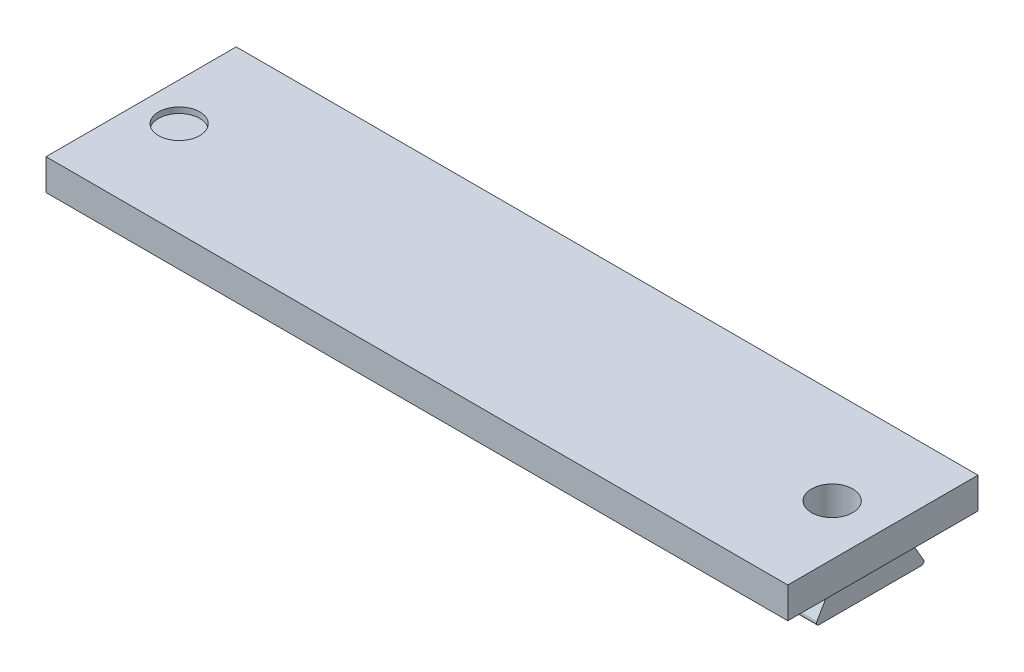
ISO-10303-21;
HEADER;
FILE_DESCRIPTION(('STEP AP214'),'2;1');
FILE_NAME('part.step','',(''),(''),'','','');
FILE_SCHEMA(('AUTOMOTIVE_DESIGN { 1 0 10303 214 1 1 1 1 }'));
ENDSEC;
DATA;
#1=APPLICATION_CONTEXT('core data for automotive mechanical design processes');
#2=APPLICATION_PROTOCOL_DEFINITION('international standard','automotive_design',2000,#1);
#3=PRODUCT_CONTEXT('',#1,'mechanical');
#4=PRODUCT('Part','Part','',(#3));
#5=PRODUCT_RELATED_PRODUCT_CATEGORY('part','',(#4));
#6=PRODUCT_DEFINITION_FORMATION('','',#4);
#7=PRODUCT_DEFINITION_CONTEXT('part definition',#1,'design');
#8=PRODUCT_DEFINITION('design','',#6,#7);
#9=PRODUCT_DEFINITION_SHAPE('','',#8);
#10=(LENGTH_UNIT() NAMED_UNIT(*) SI_UNIT(.MILLI.,.METRE.));
#11=(NAMED_UNIT(*) PLANE_ANGLE_UNIT() SI_UNIT($,.RADIAN.));
#12=(NAMED_UNIT(*) SI_UNIT($,.STERADIAN.) SOLID_ANGLE_UNIT());
#13=UNCERTAINTY_MEASURE_WITH_UNIT(LENGTH_MEASURE(1.E-05),#10,'distance_accuracy_value','');
#14=(GEOMETRIC_REPRESENTATION_CONTEXT(3) GLOBAL_UNCERTAINTY_ASSIGNED_CONTEXT((#13)) GLOBAL_UNIT_ASSIGNED_CONTEXT((#10,
#11,#12)) REPRESENTATION_CONTEXT('',''));
#15=CARTESIAN_POINT('',(0.,0.,0.));
#16=DIRECTION('',(0.,0.,1.));
#17=DIRECTION('',(1.,0.,0.));
#18=AXIS2_PLACEMENT_3D('',#15,#16,#17);
#19=CARTESIAN_POINT('',(57.5,0.,0.));
#20=DIRECTION('',(-1.,0.,0.));
#21=DIRECTION('',(0.,0.,1.));
#22=AXIS2_PLACEMENT_3D('',#19,#20,#21);
#23=PLANE('',#22);
#24=DIRECTION('',(0.,0.,-1.));
#25=VECTOR('',#24,1.);
#26=CARTESIAN_POINT('',(57.5,0.100000000000003,15.));
#27=LINE('',#26,#25);
#28=CARTESIAN_POINT('',(57.5,0.1,6.7494446500535));
#29=VERTEX_POINT('',#28);
#30=CARTESIAN_POINT('',(57.5,0.100000000000001,-6.7494446500535));
#31=VERTEX_POINT('',#30);
#32=EDGE_CURVE('E50',#29,#31,#27,.T.);
#33=ORIENTED_EDGE('',*,*,#32,.F.);
#34=CARTESIAN_POINT('',(57.5,-0.4,6.7494446500535));
#35=DIRECTION('',(-1.,0.,0.));
#36=DIRECTION('',(0.,0.,1.));
#37=AXIS2_PLACEMENT_3D('',#34,#35,#36);
#38=CIRCLE('',#37,0.5);
#39=CARTESIAN_POINT('',(57.5,-0.649999999999998,6.31643194816128));
#40=VERTEX_POINT('',#39);
#41=EDGE_CURVE('E157',#29,#40,#38,.T.);
#42=ORIENTED_EDGE('',*,*,#41,.T.);
#43=DIRECTION('',(0.,-0.866025403784441,0.499999999999995));
#44=VECTOR('',#43,1.);
#45=CARTESIAN_POINT('',(57.5,-4.9,8.77017059221715));
#46=LINE('',#45,#44);
#47=CARTESIAN_POINT('',(57.5,-4.3,8.42376043070339));
#48=VERTEX_POINT('',#47);
#49=EDGE_CURVE('E175',#40,#48,#46,.T.);
#50=ORIENTED_EDGE('',*,*,#49,.T.);
#51=CARTESIAN_POINT('',(57.5,-4.5,8.07735026918961));
#52=DIRECTION('',(-1.,0.,0.));
#53=DIRECTION('',(0.,0.,1.));
#54=AXIS2_PLACEMENT_3D('',#51,#52,#53);
#55=CIRCLE('',#54,0.4);
#56=CARTESIAN_POINT('',(57.5,-4.9,8.07735026918961));
#57=VERTEX_POINT('',#56);
#58=EDGE_CURVE('E218',#48,#57,#55,.F.);
#59=ORIENTED_EDGE('',*,*,#58,.T.);
#60=DIRECTION('',(0.,0.,-1.));
#61=VECTOR('',#60,1.);
#62=CARTESIAN_POINT('',(57.5,-4.9,-8.77017059221716));
#63=LINE('',#62,#61);
#64=CARTESIAN_POINT('',(57.5,-4.9,-8.07735026918961));
#65=VERTEX_POINT('',#64);
#66=EDGE_CURVE('E177',#57,#65,#63,.T.);
#67=ORIENTED_EDGE('',*,*,#66,.T.);
#68=CARTESIAN_POINT('',(57.5,-4.5,-8.07735026918961));
#69=DIRECTION('',(-1.,0.,0.));
#70=DIRECTION('',(0.,0.,1.));
#71=AXIS2_PLACEMENT_3D('',#68,#69,#70);
#72=CIRCLE('',#71,0.4);
#73=CARTESIAN_POINT('',(57.5,-4.3,-8.42376043070339));
#74=VERTEX_POINT('',#73);
#75=EDGE_CURVE('E220',#65,#74,#72,.F.);
#76=ORIENTED_EDGE('',*,*,#75,.T.);
#77=DIRECTION('',(0.,0.866025403784441,0.499999999999995));
#78=VECTOR('',#77,1.);
#79=CARTESIAN_POINT('',(57.5,-4.9,-8.77017059221716));
#80=LINE('',#79,#78);
#81=CARTESIAN_POINT('',(57.5,-0.649999999999997,-6.31643194816128));
#82=VERTEX_POINT('',#81);
#83=EDGE_CURVE('E181',#74,#82,#80,.T.);
#84=ORIENTED_EDGE('',*,*,#83,.T.);
#85=CARTESIAN_POINT('',(57.5,-0.399999999999999,-6.7494446500535));
#86=DIRECTION('',(-1.,0.,0.));
#87=DIRECTION('',(0.,0.,1.));
#88=AXIS2_PLACEMENT_3D('',#85,#86,#87);
#89=CIRCLE('',#88,0.5);
#90=EDGE_CURVE('E237',#82,#31,#89,.T.);
#91=ORIENTED_EDGE('',*,*,#90,.T.);
#92=EDGE_LOOP('',(#33,#42,#50,#59,#67,#76,#84,#91));
#93=FACE_BOUND('',#92,.T.);
#94=ADVANCED_FACE('F35',(#93),#23,.F.);
#95=CARTESIAN_POINT('',(57.5,5.,15.));
#96=DIRECTION('',(0.,0.,-1.));
#97=DIRECTION('',(-1.,0.,0.));
#98=AXIS2_PLACEMENT_3D('',#95,#96,#97);
#99=PLANE('',#98);
#100=DIRECTION('',(0.,-1.,0.));
#101=VECTOR('',#100,1.);
#102=CARTESIAN_POINT('',(-57.5,5.,15.));
#103=LINE('',#102,#101);
#104=CARTESIAN_POINT('',(-57.5,5.,15.));
#105=VERTEX_POINT('',#104);
#106=CARTESIAN_POINT('',(-57.5,0.1,15.));
#107=VERTEX_POINT('',#106);
#108=EDGE_CURVE('E132',#105,#107,#103,.T.);
#109=ORIENTED_EDGE('',*,*,#108,.T.);
#110=DIRECTION('',(-1.,0.,0.));
#111=VECTOR('',#110,1.);
#112=CARTESIAN_POINT('',(57.5,0.1,15.));
#113=LINE('',#112,#111);
#114=CARTESIAN_POINT('',(59.5,0.100000000000003,15.));
#115=VERTEX_POINT('',#114);
#116=EDGE_CURVE('E125',#115,#107,#113,.T.);
#117=ORIENTED_EDGE('',*,*,#116,.F.);
#118=DIRECTION('',(0.,-1.,0.));
#119=VECTOR('',#118,1.);
#120=CARTESIAN_POINT('',(59.5,5.,15.));
#121=LINE('',#120,#119);
#122=CARTESIAN_POINT('',(59.5,5.,15.));
#123=VERTEX_POINT('',#122);
#124=EDGE_CURVE('E130',#123,#115,#121,.T.);
#125=ORIENTED_EDGE('',*,*,#124,.F.);
#126=DIRECTION('',(-1.,0.,0.));
#127=VECTOR('',#126,1.);
#128=CARTESIAN_POINT('',(57.5,5.,15.));
#129=LINE('',#128,#127);
#130=EDGE_CURVE('E184',#123,#105,#129,.T.);
#131=ORIENTED_EDGE('',*,*,#130,.T.);
#132=EDGE_LOOP('',(#109,#117,#125,#131));
#133=FACE_BOUND('',#132,.T.);
#134=ADVANCED_FACE('F127',(#133),#99,.F.);
#135=CARTESIAN_POINT('',(57.5,-4.9,8.77017059221715));
#136=DIRECTION('',(0.,-0.499999999999995,-0.866025403784441));
#137=DIRECTION('',(0.,0.866025403784441,-0.499999999999995));
#138=AXIS2_PLACEMENT_3D('',#135,#136,#137);
#139=PLANE('',#138);
#140=ORIENTED_EDGE('',*,*,#49,.F.);
#141=DIRECTION('',(-1.,0.,0.));
#142=VECTOR('',#141,1.);
#143=CARTESIAN_POINT('',(-57.5,-0.649999999999998,6.31643194816128));
#144=LINE('',#143,#142);
#145=CARTESIAN_POINT('',(-57.5,-0.649999999999998,6.31643194816128));
#146=VERTEX_POINT('',#145);
#147=EDGE_CURVE('E230',#40,#146,#144,.T.);
#148=ORIENTED_EDGE('',*,*,#147,.T.);
#149=DIRECTION('',(0.,-0.866025403784441,0.499999999999995));
#150=VECTOR('',#149,1.);
#151=CARTESIAN_POINT('',(-57.5,-4.9,8.77017059221715));
#152=LINE('',#151,#150);
#153=CARTESIAN_POINT('',(-57.5,-4.3,8.42376043070339));
#154=VERTEX_POINT('',#153);
#155=EDGE_CURVE('E188',#146,#154,#152,.T.);
#156=ORIENTED_EDGE('',*,*,#155,.T.);
#157=DIRECTION('',(-1.,0.,0.));
#158=VECTOR('',#157,1.);
#159=CARTESIAN_POINT('',(57.5,-4.3,8.42376043070339));
#160=LINE('',#159,#158);
#161=EDGE_CURVE('E222',#154,#48,#160,.F.);
#162=ORIENTED_EDGE('',*,*,#161,.T.);
#163=EDGE_LOOP('',(#140,#148,#156,#162));
#164=FACE_BOUND('',#163,.T.);
#165=ADVANCED_FACE('F278',(#164),#139,.F.);
#166=CARTESIAN_POINT('',(57.5,-4.9,-8.77017059221716));
#167=DIRECTION('',(0.,1.,0.));
#168=DIRECTION('',(0.,0.,1.));
#169=AXIS2_PLACEMENT_3D('',#166,#167,#168);
#170=PLANE('',#169);
#171=CARTESIAN_POINT('',(51.5,-4.9,0.));
#172=DIRECTION('',(0.,1.,0.));
#173=DIRECTION('',(0.,0.,1.));
#174=AXIS2_PLACEMENT_3D('',#171,#172,#173);
#175=CIRCLE('',#174,4.75000000000002);
#176=CARTESIAN_POINT('',(51.5,-4.9,4.75000000000002));
#177=VERTEX_POINT('',#176);
#178=EDGE_CURVE('E43',#177,#177,#175,.T.);
#179=ORIENTED_EDGE('',*,*,#178,.T.);
#180=EDGE_LOOP('',(#179));
#181=FACE_BOUND('',#180,.T.);
#182=CARTESIAN_POINT('',(-51.5,-4.9,0.));
#183=DIRECTION('',(0.,1.,0.));
#184=DIRECTION('',(0.,0.,1.));
#185=AXIS2_PLACEMENT_3D('',#182,#183,#184);
#186=CIRCLE('',#185,4.75000000000005);
#187=CARTESIAN_POINT('',(-51.5,-4.9,4.75000000000005));
#188=VERTEX_POINT('',#187);
#189=EDGE_CURVE('E243',#188,#188,#186,.T.);
#190=ORIENTED_EDGE('',*,*,#189,.T.);
#191=EDGE_LOOP('',(#190));
#192=FACE_BOUND('',#191,.T.);
#193=DIRECTION('',(0.,0.,-1.));
#194=VECTOR('',#193,1.);
#195=CARTESIAN_POINT('',(-57.5,-4.9,-8.77017059221716));
#196=LINE('',#195,#194);
#197=CARTESIAN_POINT('',(-57.5,-4.9,8.07735026918961));
#198=VERTEX_POINT('',#197);
#199=CARTESIAN_POINT('',(-57.5,-4.9,-8.07735026918961));
#200=VERTEX_POINT('',#199);
#201=EDGE_CURVE('E190',#198,#200,#196,.T.);
#202=ORIENTED_EDGE('',*,*,#201,.T.);
#203=DIRECTION('',(-1.,0.,0.));
#204=VECTOR('',#203,1.);
#205=CARTESIAN_POINT('',(57.5,-4.9,-8.07735026918961));
#206=LINE('',#205,#204);
#207=EDGE_CURVE('E216',#200,#65,#206,.F.);
#208=ORIENTED_EDGE('',*,*,#207,.T.);
#209=ORIENTED_EDGE('',*,*,#66,.F.);
#210=DIRECTION('',(-1.,0.,0.));
#211=VECTOR('',#210,1.);
#212=CARTESIAN_POINT('',(57.5,-4.9,8.07735026918961));
#213=LINE('',#212,#211);
#214=EDGE_CURVE('E213',#57,#198,#213,.T.);
#215=ORIENTED_EDGE('',*,*,#214,.T.);
#216=EDGE_LOOP('',(#202,#208,#209,#215));
#217=FACE_BOUND('',#216,.T.);
#218=ADVANCED_FACE('F248',(#181,#192,#217),#170,.F.);
#219=CARTESIAN_POINT('',(57.5,-4.9,-8.77017059221716));
#220=DIRECTION('',(0.,-0.499999999999995,0.866025403784441));
#221=DIRECTION('',(0.,-0.866025403784441,-0.499999999999995));
#222=AXIS2_PLACEMENT_3D('',#219,#220,#221);
#223=PLANE('',#222);
#224=DIRECTION('',(0.,0.866025403784441,0.499999999999995));
#225=VECTOR('',#224,1.);
#226=CARTESIAN_POINT('',(-57.5,-4.9,-8.77017059221716));
#227=LINE('',#226,#225);
#228=CARTESIAN_POINT('',(-57.5,-4.3,-8.42376043070339));
#229=VERTEX_POINT('',#228);
#230=CARTESIAN_POINT('',(-57.5,-0.649999999999997,-6.31643194816128));
#231=VERTEX_POINT('',#230);
#232=EDGE_CURVE('E193',#229,#231,#227,.T.);
#233=ORIENTED_EDGE('',*,*,#232,.T.);
#234=DIRECTION('',(-1.,0.,0.));
#235=VECTOR('',#234,1.);
#236=CARTESIAN_POINT('',(57.5,-0.649999999999997,-6.31643194816128));
#237=LINE('',#236,#235);
#238=EDGE_CURVE('E228',#231,#82,#237,.F.);
#239=ORIENTED_EDGE('',*,*,#238,.T.);
#240=ORIENTED_EDGE('',*,*,#83,.F.);
#241=DIRECTION('',(-1.,0.,0.));
#242=VECTOR('',#241,1.);
#243=CARTESIAN_POINT('',(57.5,-4.3,-8.42376043070339));
#244=LINE('',#243,#242);
#245=EDGE_CURVE('E134',#74,#229,#244,.T.);
#246=ORIENTED_EDGE('',*,*,#245,.T.);
#247=EDGE_LOOP('',(#233,#239,#240,#246));
#248=FACE_BOUND('',#247,.T.);
#249=ADVANCED_FACE('F295',(#248),#223,.F.);
#250=CARTESIAN_POINT('',(57.5,0.100000000000001,-5.88341924626906));
#251=DIRECTION('',(0.,1.,0.));
#252=DIRECTION('',(0.,0.,1.));
#253=AXIS2_PLACEMENT_3D('',#250,#251,#252);
#254=PLANE('',#253);
#255=DIRECTION('',(-1.,0.,0.));
#256=VECTOR('',#255,1.);
#257=CARTESIAN_POINT('',(57.5,0.100000000000003,-15.));
#258=LINE('',#257,#256);
#259=CARTESIAN_POINT('',(59.5,0.100000000000003,-15.));
#260=VERTEX_POINT('',#259);
#261=CARTESIAN_POINT('',(-57.5,0.100000000000003,-15.));
#262=VERTEX_POINT('',#261);
#263=EDGE_CURVE('E135',#260,#262,#258,.T.);
#264=ORIENTED_EDGE('',*,*,#263,.F.);
#265=DIRECTION('',(0.,0.,-1.));
#266=VECTOR('',#265,1.);
#267=CARTESIAN_POINT('',(59.5,0.100000000000003,15.));
#268=LINE('',#267,#266);
#269=EDGE_CURVE('E138',#115,#260,#268,.T.);
#270=ORIENTED_EDGE('',*,*,#269,.F.);
#271=ORIENTED_EDGE('',*,*,#116,.T.);
#272=DIRECTION('',(0.,0.,-1.));
#273=VECTOR('',#272,1.);
#274=CARTESIAN_POINT('',(-57.5,0.1,5.88341924626906));
#275=LINE('',#274,#273);
#276=CARTESIAN_POINT('',(-57.5,0.1,6.7494446500535));
#277=VERTEX_POINT('',#276);
#278=EDGE_CURVE('E186',#107,#277,#275,.T.);
#279=ORIENTED_EDGE('',*,*,#278,.T.);
#280=DIRECTION('',(-1.,0.,0.));
#281=VECTOR('',#280,1.);
#282=CARTESIAN_POINT('',(57.5,0.1,6.7494446500535));
#283=LINE('',#282,#281);
#284=EDGE_CURVE('E233',#277,#29,#283,.F.);
#285=ORIENTED_EDGE('',*,*,#284,.T.);
#286=ORIENTED_EDGE('',*,*,#32,.T.);
#287=DIRECTION('',(-1.,0.,0.));
#288=VECTOR('',#287,1.);
#289=CARTESIAN_POINT('',(-57.5,0.100000000000001,-6.7494446500535));
#290=LINE('',#289,#288);
#291=CARTESIAN_POINT('',(-57.5,0.100000000000001,-6.7494446500535));
#292=VERTEX_POINT('',#291);
#293=EDGE_CURVE('E225',#31,#292,#290,.T.);
#294=ORIENTED_EDGE('',*,*,#293,.T.);
#295=DIRECTION('',(0.,0.,-1.));
#296=VECTOR('',#295,1.);
#297=CARTESIAN_POINT('',(-57.5,0.100000000000001,-5.88341924626906));
#298=LINE('',#297,#296);
#299=EDGE_CURVE('E196',#292,#262,#298,.T.);
#300=ORIENTED_EDGE('',*,*,#299,.T.);
#301=EDGE_LOOP('',(#264,#270,#271,#279,#285,#286,#294,#300));
#302=FACE_BOUND('',#301,.T.);
#303=ADVANCED_FACE('F139',(#302),#254,.F.);
#304=CARTESIAN_POINT('',(57.5,5.,-15.));
#305=DIRECTION('',(0.,0.,1.));
#306=DIRECTION('',(1.,0.,0.));
#307=AXIS2_PLACEMENT_3D('',#304,#305,#306);
#308=PLANE('',#307);
#309=DIRECTION('',(0.,1.,0.));
#310=VECTOR('',#309,1.);
#311=CARTESIAN_POINT('',(-57.5,5.,-15.));
#312=LINE('',#311,#310);
#313=CARTESIAN_POINT('',(-57.5,5.,-15.));
#314=VERTEX_POINT('',#313);
#315=EDGE_CURVE('E198',#262,#314,#312,.T.);
#316=ORIENTED_EDGE('',*,*,#315,.T.);
#317=DIRECTION('',(-1.,0.,0.));
#318=VECTOR('',#317,1.);
#319=CARTESIAN_POINT('',(57.5,5.,-15.));
#320=LINE('',#319,#318);
#321=CARTESIAN_POINT('',(59.5,5.,-15.));
#322=VERTEX_POINT('',#321);
#323=EDGE_CURVE('E202',#322,#314,#320,.T.);
#324=ORIENTED_EDGE('',*,*,#323,.F.);
#325=DIRECTION('',(0.,1.,0.));
#326=VECTOR('',#325,1.);
#327=CARTESIAN_POINT('',(59.5,5.,-15.));
#328=LINE('',#327,#326);
#329=EDGE_CURVE('E144',#260,#322,#328,.T.);
#330=ORIENTED_EDGE('',*,*,#329,.F.);
#331=ORIENTED_EDGE('',*,*,#263,.T.);
#332=EDGE_LOOP('',(#316,#324,#330,#331));
#333=FACE_BOUND('',#332,.T.);
#334=ADVANCED_FACE('F288',(#333),#308,.F.);
#335=CARTESIAN_POINT('',(57.5,5.,15.));
#336=DIRECTION('',(0.,-1.,0.));
#337=DIRECTION('',(0.,0.,-1.));
#338=AXIS2_PLACEMENT_3D('',#335,#336,#337);
#339=PLANE('',#338);
#340=CARTESIAN_POINT('',(-51.5,5.,0.));
#341=DIRECTION('',(0.,1.,0.));
#342=DIRECTION('',(0.,0.,1.));
#343=AXIS2_PLACEMENT_3D('',#340,#341,#342);
#344=CIRCLE('',#343,3.25);
#345=CARTESIAN_POINT('',(-51.5,5.,3.25));
#346=VERTEX_POINT('',#345);
#347=EDGE_CURVE('E154',#346,#346,#344,.T.);
#348=ORIENTED_EDGE('',*,*,#347,.F.);
#349=EDGE_LOOP('',(#348));
#350=FACE_BOUND('',#349,.T.);
#351=CARTESIAN_POINT('',(51.5,5.,0.));
#352=DIRECTION('',(0.,1.,0.));
#353=DIRECTION('',(0.,0.,1.));
#354=AXIS2_PLACEMENT_3D('',#351,#352,#353);
#355=CIRCLE('',#354,3.25);
#356=CARTESIAN_POINT('',(51.5,5.,3.25));
#357=VERTEX_POINT('',#356);
#358=EDGE_CURVE('E166',#357,#357,#355,.T.);
#359=ORIENTED_EDGE('',*,*,#358,.F.);
#360=EDGE_LOOP('',(#359));
#361=FACE_BOUND('',#360,.T.);
#362=DIRECTION('',(0.,0.,1.));
#363=VECTOR('',#362,1.);
#364=CARTESIAN_POINT('',(-57.5,5.,15.));
#365=LINE('',#364,#363);
#366=EDGE_CURVE('E178',#314,#105,#365,.T.);
#367=ORIENTED_EDGE('',*,*,#366,.T.);
#368=ORIENTED_EDGE('',*,*,#130,.F.);
#369=DIRECTION('',(0.,0.,1.));
#370=VECTOR('',#369,1.);
#371=CARTESIAN_POINT('',(59.5,5.,15.));
#372=LINE('',#371,#370);
#373=EDGE_CURVE('E149',#322,#123,#372,.T.);
#374=ORIENTED_EDGE('',*,*,#373,.F.);
#375=ORIENTED_EDGE('',*,*,#323,.T.);
#376=EDGE_LOOP('',(#367,#368,#374,#375));
#377=FACE_BOUND('',#376,.T.);
#378=ADVANCED_FACE('F285',(#350,#361,#377),#339,.F.);
#379=CARTESIAN_POINT('',(-57.5,0.,0.));
#380=DIRECTION('',(-1.,0.,0.));
#381=DIRECTION('',(0.,0.,1.));
#382=AXIS2_PLACEMENT_3D('',#379,#380,#381);
#383=PLANE('',#382);
#384=ORIENTED_EDGE('',*,*,#232,.F.);
#385=CARTESIAN_POINT('',(-57.5,-4.5,-8.07735026918961));
#386=DIRECTION('',(-1.,0.,0.));
#387=DIRECTION('',(0.,0.,1.));
#388=AXIS2_PLACEMENT_3D('',#385,#386,#387);
#389=CIRCLE('',#388,0.4);
#390=EDGE_CURVE('E211',#229,#200,#389,.T.);
#391=ORIENTED_EDGE('',*,*,#390,.T.);
#392=ORIENTED_EDGE('',*,*,#201,.F.);
#393=CARTESIAN_POINT('',(-57.5,-4.5,8.07735026918961));
#394=DIRECTION('',(-1.,0.,0.));
#395=DIRECTION('',(0.,0.,1.));
#396=AXIS2_PLACEMENT_3D('',#393,#394,#395);
#397=CIRCLE('',#396,0.4);
#398=EDGE_CURVE('E208',#198,#154,#397,.T.);
#399=ORIENTED_EDGE('',*,*,#398,.T.);
#400=ORIENTED_EDGE('',*,*,#155,.F.);
#401=CARTESIAN_POINT('',(-57.5,-0.4,6.7494446500535));
#402=DIRECTION('',(-1.,0.,0.));
#403=DIRECTION('',(0.,0.,1.));
#404=AXIS2_PLACEMENT_3D('',#401,#402,#403);
#405=CIRCLE('',#404,0.5);
#406=EDGE_CURVE('E58',#146,#277,#405,.F.);
#407=ORIENTED_EDGE('',*,*,#406,.T.);
#408=ORIENTED_EDGE('',*,*,#278,.F.);
#409=ORIENTED_EDGE('',*,*,#108,.F.);
#410=ORIENTED_EDGE('',*,*,#366,.F.);
#411=ORIENTED_EDGE('',*,*,#315,.F.);
#412=ORIENTED_EDGE('',*,*,#299,.F.);
#413=CARTESIAN_POINT('',(-57.5,-0.399999999999999,-6.7494446500535));
#414=DIRECTION('',(-1.,0.,0.));
#415=DIRECTION('',(0.,0.,1.));
#416=AXIS2_PLACEMENT_3D('',#413,#414,#415);
#417=CIRCLE('',#416,0.5);
#418=EDGE_CURVE('E235',#292,#231,#417,.F.);
#419=ORIENTED_EDGE('',*,*,#418,.T.);
#420=EDGE_LOOP('',(#384,#391,#392,#399,#400,#407,#408,#409,#410,#411,#412,#419));
#421=FACE_BOUND('',#420,.T.);
#422=ADVANCED_FACE('F281',(#421),#383,.T.);
#423=CARTESIAN_POINT('',(57.5,-4.5,-8.07735026918961));
#424=DIRECTION('',(-1.,0.,0.));
#425=DIRECTION('',(0.,0.,1.));
#426=AXIS2_PLACEMENT_3D('',#423,#424,#425);
#427=CYLINDRICAL_SURFACE('',#426,0.4);
#428=ORIENTED_EDGE('',*,*,#75,.F.);
#429=ORIENTED_EDGE('',*,*,#207,.F.);
#430=ORIENTED_EDGE('',*,*,#390,.F.);
#431=ORIENTED_EDGE('',*,*,#245,.F.);
#432=EDGE_LOOP('',(#428,#429,#430,#431));
#433=FACE_BOUND('',#432,.T.);
#434=ADVANCED_FACE('F284',(#433),#427,.T.);
#435=CARTESIAN_POINT('',(57.5,-4.5,8.07735026918961));
#436=DIRECTION('',(-1.,0.,0.));
#437=DIRECTION('',(0.,0.,1.));
#438=AXIS2_PLACEMENT_3D('',#435,#436,#437);
#439=CYLINDRICAL_SURFACE('',#438,0.4);
#440=ORIENTED_EDGE('',*,*,#58,.F.);
#441=ORIENTED_EDGE('',*,*,#161,.F.);
#442=ORIENTED_EDGE('',*,*,#398,.F.);
#443=ORIENTED_EDGE('',*,*,#214,.F.);
#444=EDGE_LOOP('',(#440,#441,#442,#443));
#445=FACE_BOUND('',#444,.T.);
#446=ADVANCED_FACE('F306',(#445),#439,.T.);
#447=CARTESIAN_POINT('',(57.5,-0.399999999999999,-6.7494446500535));
#448=DIRECTION('',(1.,0.,0.));
#449=DIRECTION('',(0.,0.,-1.));
#450=AXIS2_PLACEMENT_3D('',#447,#448,#449);
#451=CYLINDRICAL_SURFACE('',#450,0.5);
#452=ORIENTED_EDGE('',*,*,#90,.F.);
#453=ORIENTED_EDGE('',*,*,#238,.F.);
#454=ORIENTED_EDGE('',*,*,#418,.F.);
#455=ORIENTED_EDGE('',*,*,#293,.F.);
#456=EDGE_LOOP('',(#452,#453,#454,#455));
#457=FACE_BOUND('',#456,.T.);
#458=ADVANCED_FACE('F310',(#457),#451,.F.);
#459=CARTESIAN_POINT('',(57.5,-0.4,6.7494446500535));
#460=DIRECTION('',(1.,0.,0.));
#461=DIRECTION('',(0.,0.,-1.));
#462=AXIS2_PLACEMENT_3D('',#459,#460,#461);
#463=CYLINDRICAL_SURFACE('',#462,0.5);
#464=ORIENTED_EDGE('',*,*,#41,.F.);
#465=ORIENTED_EDGE('',*,*,#284,.F.);
#466=ORIENTED_EDGE('',*,*,#406,.F.);
#467=ORIENTED_EDGE('',*,*,#147,.F.);
#468=EDGE_LOOP('',(#464,#465,#466,#467));
#469=FACE_BOUND('',#468,.T.);
#470=ADVANCED_FACE('F260',(#469),#463,.F.);
#471=CARTESIAN_POINT('',(51.5,-1.9,0.));
#472=DIRECTION('',(0.,-1.,0.));
#473=DIRECTION('',(0.,0.,-1.));
#474=AXIS2_PLACEMENT_3D('',#471,#472,#473);
#475=CYLINDRICAL_SURFACE('',#474,4.25);
#476=CARTESIAN_POINT('',(51.5,-4.39999999999998,0.));
#477=DIRECTION('',(0.,1.,0.));
#478=DIRECTION('',(0.,0.,1.));
#479=AXIS2_PLACEMENT_3D('',#476,#477,#478);
#480=CIRCLE('',#479,4.25);
#481=CARTESIAN_POINT('',(51.5,-4.39999999999998,4.25));
#482=VERTEX_POINT('',#481);
#483=EDGE_CURVE('E156',#482,#482,#480,.F.);
#484=ORIENTED_EDGE('',*,*,#483,.T.);
#485=EDGE_LOOP('',(#484));
#486=FACE_BOUND('',#485,.T.);
#487=CARTESIAN_POINT('',(51.5,-1.9,0.));
#488=DIRECTION('',(0.,-1.,0.));
#489=DIRECTION('',(0.,0.,-1.));
#490=AXIS2_PLACEMENT_3D('',#487,#488,#489);
#491=CIRCLE('',#490,4.25);
#492=CARTESIAN_POINT('',(51.5,-1.9,-4.25));
#493=VERTEX_POINT('',#492);
#494=EDGE_CURVE('E172',#493,#493,#491,.T.);
#495=ORIENTED_EDGE('',*,*,#494,.F.);
#496=EDGE_LOOP('',(#495));
#497=FACE_BOUND('',#496,.T.);
#498=ADVANCED_FACE('F256',(#486,#497),#475,.F.);
#499=CARTESIAN_POINT('',(51.5,-1.9,0.));
#500=DIRECTION('',(0.,-1.,0.));
#501=DIRECTION('',(0.,0.,-1.));
#502=AXIS2_PLACEMENT_3D('',#499,#500,#501);
#503=PLANE('',#502);
#504=ORIENTED_EDGE('',*,*,#494,.T.);
#505=EDGE_LOOP('',(#504));
#506=FACE_BOUND('',#505,.T.);
#507=ADVANCED_FACE('F259',(#506),#503,.T.);
#508=CARTESIAN_POINT('',(51.5,-0.9,0.));
#509=DIRECTION('',(0.,-1.,0.));
#510=DIRECTION('',(0.,0.,-1.));
#511=AXIS2_PLACEMENT_3D('',#508,#509,#510);
#512=PLANE('',#511);
#513=CARTESIAN_POINT('',(51.5,-0.9,0.));
#514=DIRECTION('',(0.,-1.,0.));
#515=DIRECTION('',(0.,0.,-1.));
#516=AXIS2_PLACEMENT_3D('',#513,#514,#515);
#517=CIRCLE('',#516,3.25);
#518=CARTESIAN_POINT('',(51.5,-0.9,-3.25));
#519=VERTEX_POINT('',#518);
#520=EDGE_CURVE('E169',#519,#519,#517,.F.);
#521=ORIENTED_EDGE('',*,*,#520,.T.);
#522=EDGE_LOOP('',(#521));
#523=FACE_BOUND('',#522,.T.);
#524=ADVANCED_FACE('F265',(#523),#512,.F.);
#525=CARTESIAN_POINT('',(51.5,-11.0923881554251,0.));
#526=DIRECTION('',(0.,1.,0.));
#527=DIRECTION('',(0.,0.,1.));
#528=AXIS2_PLACEMENT_3D('',#525,#526,#527);
#529=CYLINDRICAL_SURFACE('',#528,3.25);
#530=ORIENTED_EDGE('',*,*,#358,.T.);
#531=EDGE_LOOP('',(#530));
#532=FACE_BOUND('',#531,.T.);
#533=ORIENTED_EDGE('',*,*,#520,.F.);
#534=EDGE_LOOP('',(#533));
#535=FACE_BOUND('',#534,.T.);
#536=ADVANCED_FACE('F270',(#532,#535),#529,.F.);
#537=CARTESIAN_POINT('',(-51.5,3.1,0.));
#538=DIRECTION('',(0.,-1.,0.));
#539=DIRECTION('',(0.,0.,-1.));
#540=AXIS2_PLACEMENT_3D('',#537,#538,#539);
#541=CYLINDRICAL_SURFACE('',#540,4.25);
#542=CARTESIAN_POINT('',(-51.5,-4.39999999999997,0.));
#543=DIRECTION('',(0.,1.,0.));
#544=DIRECTION('',(0.,0.,1.));
#545=AXIS2_PLACEMENT_3D('',#542,#543,#544);
#546=CIRCLE('',#545,4.25);
#547=CARTESIAN_POINT('',(-51.5,-4.39999999999997,4.25));
#548=VERTEX_POINT('',#547);
#549=EDGE_CURVE('E12',#548,#548,#546,.F.);
#550=ORIENTED_EDGE('',*,*,#549,.T.);
#551=EDGE_LOOP('',(#550));
#552=FACE_BOUND('',#551,.T.);
#553=CARTESIAN_POINT('',(-51.5,3.1,0.));
#554=DIRECTION('',(0.,-1.,0.));
#555=DIRECTION('',(0.,0.,-1.));
#556=AXIS2_PLACEMENT_3D('',#553,#554,#555);
#557=CIRCLE('',#556,4.25);
#558=CARTESIAN_POINT('',(-51.5,3.1,-4.25));
#559=VERTEX_POINT('',#558);
#560=EDGE_CURVE('E163',#559,#559,#557,.T.);
#561=ORIENTED_EDGE('',*,*,#560,.F.);
#562=EDGE_LOOP('',(#561));
#563=FACE_BOUND('',#562,.T.);
#564=ADVANCED_FACE('F357',(#552,#563),#541,.F.);
#565=CARTESIAN_POINT('',(-51.5,3.1,0.));
#566=DIRECTION('',(0.,-1.,0.));
#567=DIRECTION('',(0.,0.,-1.));
#568=AXIS2_PLACEMENT_3D('',#565,#566,#567);
#569=PLANE('',#568);
#570=ORIENTED_EDGE('',*,*,#560,.T.);
#571=EDGE_LOOP('',(#570));
#572=FACE_BOUND('',#571,.T.);
#573=ADVANCED_FACE('F362',(#572),#569,.T.);
#574=CARTESIAN_POINT('',(-51.5,4.1,0.));
#575=DIRECTION('',(0.,-1.,0.));
#576=DIRECTION('',(0.,0.,-1.));
#577=AXIS2_PLACEMENT_3D('',#574,#575,#576);
#578=PLANE('',#577);
#579=CARTESIAN_POINT('',(-51.5,4.1,0.));
#580=DIRECTION('',(0.,-1.,0.));
#581=DIRECTION('',(0.,0.,-1.));
#582=AXIS2_PLACEMENT_3D('',#579,#580,#581);
#583=CIRCLE('',#582,3.25);
#584=CARTESIAN_POINT('',(-51.5,4.1,-3.25));
#585=VERTEX_POINT('',#584);
#586=EDGE_CURVE('E160',#585,#585,#583,.F.);
#587=ORIENTED_EDGE('',*,*,#586,.T.);
#588=EDGE_LOOP('',(#587));
#589=FACE_BOUND('',#588,.T.);
#590=ADVANCED_FACE('F393',(#589),#578,.F.);
#591=CARTESIAN_POINT('',(-51.5,-6.09238815542512,0.));
#592=DIRECTION('',(0.,1.,0.));
#593=DIRECTION('',(0.,0.,1.));
#594=AXIS2_PLACEMENT_3D('',#591,#592,#593);
#595=CYLINDRICAL_SURFACE('',#594,3.25);
#596=ORIENTED_EDGE('',*,*,#347,.T.);
#597=EDGE_LOOP('',(#596));
#598=FACE_BOUND('',#597,.T.);
#599=ORIENTED_EDGE('',*,*,#586,.F.);
#600=EDGE_LOOP('',(#599));
#601=FACE_BOUND('',#600,.T.);
#602=ADVANCED_FACE('F398',(#598,#601),#595,.F.);
#603=CARTESIAN_POINT('',(59.5,0.,0.));
#604=DIRECTION('',(1.,0.,0.));
#605=DIRECTION('',(0.,0.,-1.));
#606=AXIS2_PLACEMENT_3D('',#603,#604,#605);
#607=PLANE('',#606);
#608=ORIENTED_EDGE('',*,*,#124,.T.);
#609=ORIENTED_EDGE('',*,*,#269,.T.);
#610=ORIENTED_EDGE('',*,*,#329,.T.);
#611=ORIENTED_EDGE('',*,*,#373,.T.);
#612=EDGE_LOOP('',(#608,#609,#610,#611));
#613=FACE_BOUND('',#612,.T.);
#614=ADVANCED_FACE('F147',(#613),#607,.T.);
#615=CARTESIAN_POINT('',(51.5,-4.39999999999998,0.));
#616=DIRECTION('',(0.,-1.,0.));
#617=DIRECTION('',(0.,0.,-1.));
#618=AXIS2_PLACEMENT_3D('',#615,#616,#617);
#619=CONICAL_SURFACE('',#618,4.25,0.785398163397447);
#620=ORIENTED_EDGE('',*,*,#178,.F.);
#621=EDGE_LOOP('',(#620));
#622=FACE_BOUND('',#621,.T.);
#623=ORIENTED_EDGE('',*,*,#483,.F.);
#624=EDGE_LOOP('',(#623));
#625=FACE_BOUND('',#624,.T.);
#626=ADVANCED_FACE('F251',(#622,#625),#619,.F.);
#627=CARTESIAN_POINT('',(-51.5,-4.39999999999997,0.));
#628=DIRECTION('',(0.,-1.,0.));
#629=DIRECTION('',(0.,0.,-1.));
#630=AXIS2_PLACEMENT_3D('',#627,#628,#629);
#631=CONICAL_SURFACE('',#630,4.25,0.785398163397461);
#632=ORIENTED_EDGE('',*,*,#189,.F.);
#633=EDGE_LOOP('',(#632));
#634=FACE_BOUND('',#633,.T.);
#635=ORIENTED_EDGE('',*,*,#549,.F.);
#636=EDGE_LOOP('',(#635));
#637=FACE_BOUND('',#636,.T.);
#638=ADVANCED_FACE('F37',(#634,#637),#631,.F.);
#639=CLOSED_SHELL('',(#94,#134,#165,#218,#249,#303,#334,#378,#422,#434,#446,#458,#470,#498,#507,
#524,#536,#564,#573,#590,#602,#614,#626,#638));
#640=MANIFOLD_SOLID_BREP('B2',#639);
#641=ADVANCED_BREP_SHAPE_REPRESENTATION('',(#18,#640),#14);
#642=SHAPE_DEFINITION_REPRESENTATION(#9,#641);
ENDSEC;
END-ISO-10303-21;
